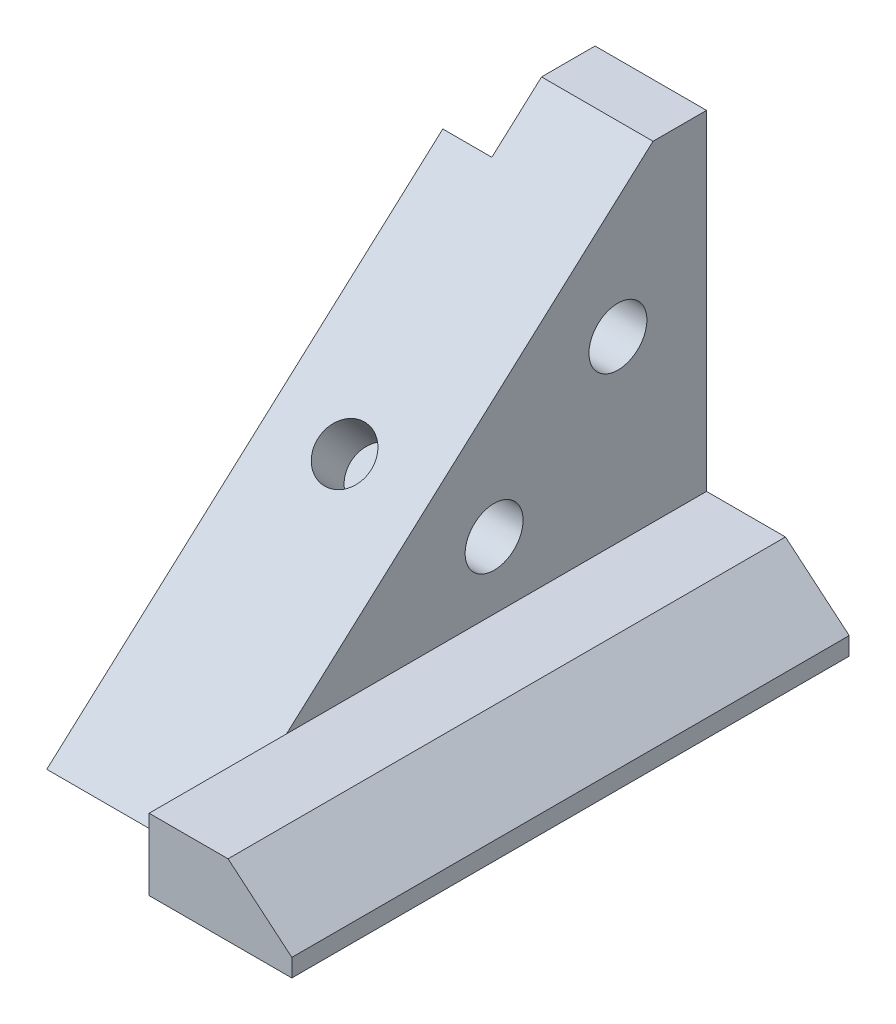
ISO-10303-21;
HEADER;
FILE_DESCRIPTION(('STEP AP214'),'2;1');
FILE_NAME('part.step','',(''),(''),'','','');
FILE_SCHEMA(('AUTOMOTIVE_DESIGN { 1 0 10303 214 1 1 1 1 }'));
ENDSEC;
DATA;
#1=APPLICATION_CONTEXT('core data for automotive mechanical design processes');
#2=APPLICATION_PROTOCOL_DEFINITION('international standard','automotive_design',2000,#1);
#3=PRODUCT_CONTEXT('',#1,'mechanical');
#4=PRODUCT('Part','Part','',(#3));
#5=PRODUCT_RELATED_PRODUCT_CATEGORY('part','',(#4));
#6=PRODUCT_DEFINITION_FORMATION('','',#4);
#7=PRODUCT_DEFINITION_CONTEXT('part definition',#1,'design');
#8=PRODUCT_DEFINITION('design','',#6,#7);
#9=PRODUCT_DEFINITION_SHAPE('','',#8);
#10=(LENGTH_UNIT() NAMED_UNIT(*) SI_UNIT(.MILLI.,.METRE.));
#11=(NAMED_UNIT(*) PLANE_ANGLE_UNIT() SI_UNIT($,.RADIAN.));
#12=(NAMED_UNIT(*) SI_UNIT($,.STERADIAN.) SOLID_ANGLE_UNIT());
#13=UNCERTAINTY_MEASURE_WITH_UNIT(LENGTH_MEASURE(1.E-05),#10,'distance_accuracy_value','');
#14=(GEOMETRIC_REPRESENTATION_CONTEXT(3) GLOBAL_UNCERTAINTY_ASSIGNED_CONTEXT((#13)) GLOBAL_UNIT_ASSIGNED_CONTEXT((#10,
#11,#12)) REPRESENTATION_CONTEXT('',''));
#15=CARTESIAN_POINT('',(0.,0.,0.));
#16=DIRECTION('',(0.,0.,1.));
#17=DIRECTION('',(1.,0.,0.));
#18=AXIS2_PLACEMENT_3D('',#15,#16,#17);
#19=CARTESIAN_POINT('',(36.,0.,0.));
#20=DIRECTION('',(0.,0.,1.));
#21=DIRECTION('',(1.,0.,0.));
#22=AXIS2_PLACEMENT_3D('',#19,#20,#21);
#23=PLANE('',#22);
#24=DIRECTION('',(-0.766044443118975,0.642787609686543,0.));
#25=VECTOR('',#24,1.);
#26=CARTESIAN_POINT('',(30.0655774653491,35.830759957749,0.));
#27=LINE('',#26,#25);
#28=CARTESIAN_POINT('',(68.,4.,0.));
#29=VERTEX_POINT('',#28);
#30=CARTESIAN_POINT('',(53.6989568888697,16.,0.));
#31=VERTEX_POINT('',#30);
#32=EDGE_CURVE('E168',#29,#31,#27,.T.);
#33=ORIENTED_EDGE('',*,*,#32,.F.);
#34=DIRECTION('',(0.,1.,0.));
#35=VECTOR('',#34,1.);
#36=CARTESIAN_POINT('',(68.,0.,0.));
#37=LINE('',#36,#35);
#38=CARTESIAN_POINT('',(68.,0.,0.));
#39=VERTEX_POINT('',#38);
#40=EDGE_CURVE('E167',#39,#29,#37,.T.);
#41=ORIENTED_EDGE('',*,*,#40,.F.);
#42=DIRECTION('',(-1.,0.,0.));
#43=VECTOR('',#42,1.);
#44=CARTESIAN_POINT('',(36.,0.,0.));
#45=LINE('',#44,#43);
#46=CARTESIAN_POINT('',(0.,0.,0.));
#47=VERTEX_POINT('',#46);
#48=EDGE_CURVE('E90',#39,#47,#45,.T.);
#49=ORIENTED_EDGE('',*,*,#48,.T.);
#50=DIRECTION('',(0.,1.,0.));
#51=VECTOR('',#50,1.);
#52=CARTESIAN_POINT('',(0.,0.,0.));
#53=LINE('',#52,#51);
#54=CARTESIAN_POINT('',(0.,54.2555015740803,0.));
#55=VERTEX_POINT('',#54);
#56=EDGE_CURVE('E156',#47,#55,#53,.T.);
#57=ORIENTED_EDGE('',*,*,#56,.T.);
#58=DIRECTION('',(1.,0.,0.));
#59=VECTOR('',#58,1.);
#60=CARTESIAN_POINT('',(0.,54.2555015740803,0.));
#61=LINE('',#60,#59);
#62=CARTESIAN_POINT('',(11.,54.2555015740803,0.));
#63=VERTEX_POINT('',#62);
#64=EDGE_CURVE('E230',#55,#63,#61,.T.);
#65=ORIENTED_EDGE('',*,*,#64,.T.);
#66=DIRECTION('',(0.,1.,0.));
#67=VECTOR('',#66,1.);
#68=CARTESIAN_POINT('',(11.,-0.00104952517931967,0.));
#69=LINE('',#68,#67);
#70=CARTESIAN_POINT('',(11.,90.,0.));
#71=VERTEX_POINT('',#70);
#72=EDGE_CURVE('E177',#63,#71,#69,.T.);
#73=ORIENTED_EDGE('',*,*,#72,.T.);
#74=DIRECTION('',(-1.,0.,0.));
#75=VECTOR('',#74,1.);
#76=CARTESIAN_POINT('',(36.,90.,0.));
#77=LINE('',#76,#75);
#78=CARTESIAN_POINT('',(36.,90.,0.));
#79=VERTEX_POINT('',#78);
#80=EDGE_CURVE('E137',#79,#71,#77,.T.);
#81=ORIENTED_EDGE('',*,*,#80,.F.);
#82=DIRECTION('',(0.,1.,0.));
#83=VECTOR('',#82,1.);
#84=CARTESIAN_POINT('',(36.,0.,0.));
#85=LINE('',#84,#83);
#86=CARTESIAN_POINT('',(36.,16.,0.));
#87=VERTEX_POINT('',#86);
#88=EDGE_CURVE('E129',#87,#79,#85,.T.);
#89=ORIENTED_EDGE('',*,*,#88,.F.);
#90=DIRECTION('',(-1.,0.,0.));
#91=VECTOR('',#90,1.);
#92=CARTESIAN_POINT('',(68.,16.,0.));
#93=LINE('',#92,#91);
#94=EDGE_CURVE('E115',#31,#87,#93,.T.);
#95=ORIENTED_EDGE('',*,*,#94,.F.);
#96=EDGE_LOOP('',(#33,#41,#49,#57,#65,#73,#81,#89,#95));
#97=FACE_BOUND('',#96,.T.);
#98=ADVANCED_FACE('F41',(#97),#23,.F.);
#99=CARTESIAN_POINT('',(68.,16.,0.));
#100=DIRECTION('',(0.,-1.,0.));
#101=DIRECTION('',(0.,0.,-1.));
#102=AXIS2_PLACEMENT_3D('',#99,#100,#101);
#103=PLANE('',#102);
#104=DIRECTION('',(0.,0.,1.));
#105=VECTOR('',#104,1.);
#106=CARTESIAN_POINT('',(53.6989568888697,16.,0.));
#107=LINE('',#106,#105);
#108=CARTESIAN_POINT('',(53.6989568888697,16.,125.));
#109=VERTEX_POINT('',#108);
#110=EDGE_CURVE('E58',#31,#109,#107,.T.);
#111=ORIENTED_EDGE('',*,*,#110,.F.);
#112=ORIENTED_EDGE('',*,*,#94,.T.);
#113=DIRECTION('',(0.,0.,1.));
#114=VECTOR('',#113,1.);
#115=CARTESIAN_POINT('',(36.,16.,0.));
#116=LINE('',#115,#114);
#117=CARTESIAN_POINT('',(36.,16.,94.1853260973612));
#118=VERTEX_POINT('',#117);
#119=EDGE_CURVE('E116',#87,#118,#116,.T.);
#120=ORIENTED_EDGE('',*,*,#119,.T.);
#121=CARTESIAN_POINT('',(36.,16.,125.));
#122=VERTEX_POINT('',#121);
#123=EDGE_CURVE('E133',#118,#122,#116,.T.);
#124=ORIENTED_EDGE('',*,*,#123,.T.);
#125=DIRECTION('',(1.,0.,0.));
#126=VECTOR('',#125,1.);
#127=CARTESIAN_POINT('',(68.,16.,125.));
#128=LINE('',#127,#126);
#129=EDGE_CURVE('E122',#109,#122,#128,.F.);
#130=ORIENTED_EDGE('',*,*,#129,.F.);
#131=EDGE_LOOP('',(#111,#112,#120,#124,#130));
#132=FACE_BOUND('',#131,.T.);
#133=ADVANCED_FACE('F111',(#132),#103,.F.);
#134=CARTESIAN_POINT('',(68.,0.,125.));
#135=DIRECTION('',(0.,0.,1.));
#136=DIRECTION('',(1.,0.,0.));
#137=AXIS2_PLACEMENT_3D('',#134,#135,#136);
#138=PLANE('',#137);
#139=DIRECTION('',(0.,1.,0.));
#140=VECTOR('',#139,1.);
#141=CARTESIAN_POINT('',(68.,0.,125.));
#142=LINE('',#141,#140);
#143=CARTESIAN_POINT('',(68.,0.,125.));
#144=VERTEX_POINT('',#143);
#145=CARTESIAN_POINT('',(68.,4.,125.));
#146=VERTEX_POINT('',#145);
#147=EDGE_CURVE('E44',#144,#146,#142,.T.);
#148=ORIENTED_EDGE('',*,*,#147,.T.);
#149=DIRECTION('',(-0.766044443118975,0.642787609686543,0.));
#150=VECTOR('',#149,1.);
#151=CARTESIAN_POINT('',(68.,4.,125.));
#152=LINE('',#151,#150);
#153=EDGE_CURVE('E166',#146,#109,#152,.T.);
#154=ORIENTED_EDGE('',*,*,#153,.T.);
#155=ORIENTED_EDGE('',*,*,#129,.T.);
#156=DIRECTION('',(0.,1.,0.));
#157=VECTOR('',#156,1.);
#158=CARTESIAN_POINT('',(36.,0.,125.));
#159=LINE('',#158,#157);
#160=CARTESIAN_POINT('',(36.,0.,125.));
#161=VERTEX_POINT('',#160);
#162=EDGE_CURVE('E134',#161,#122,#159,.T.);
#163=ORIENTED_EDGE('',*,*,#162,.F.);
#164=DIRECTION('',(-1.,0.,0.));
#165=VECTOR('',#164,1.);
#166=CARTESIAN_POINT('',(68.,0.,125.));
#167=LINE('',#166,#165);
#168=EDGE_CURVE('E78',#144,#161,#167,.T.);
#169=ORIENTED_EDGE('',*,*,#168,.F.);
#170=EDGE_LOOP('',(#148,#154,#155,#163,#169));
#171=FACE_BOUND('',#170,.T.);
#172=ADVANCED_FACE('F171',(#171),#138,.T.);
#173=CARTESIAN_POINT('',(68.,0.,0.));
#174=DIRECTION('',(1.,0.,0.));
#175=DIRECTION('',(0.,0.,-1.));
#176=AXIS2_PLACEMENT_3D('',#173,#174,#175);
#177=PLANE('',#176);
#178=ORIENTED_EDGE('',*,*,#40,.T.);
#179=DIRECTION('',(0.,0.,1.));
#180=VECTOR('',#179,1.);
#181=CARTESIAN_POINT('',(68.,4.,0.));
#182=LINE('',#181,#180);
#183=EDGE_CURVE('E189',#29,#146,#182,.T.);
#184=ORIENTED_EDGE('',*,*,#183,.T.);
#185=ORIENTED_EDGE('',*,*,#147,.F.);
#186=DIRECTION('',(0.,0.,1.));
#187=VECTOR('',#186,1.);
#188=CARTESIAN_POINT('',(68.,0.,0.));
#189=LINE('',#188,#187);
#190=EDGE_CURVE('E163',#39,#144,#189,.T.);
#191=ORIENTED_EDGE('',*,*,#190,.F.);
#192=EDGE_LOOP('',(#178,#184,#185,#191));
#193=FACE_BOUND('',#192,.T.);
#194=ADVANCED_FACE('F186',(#193),#177,.T.);
#195=CARTESIAN_POINT('',(0.,0.,0.));
#196=DIRECTION('',(1.,0.,0.));
#197=DIRECTION('',(0.,0.,-1.));
#198=AXIS2_PLACEMENT_3D('',#195,#196,#197);
#199=PLANE('',#198);
#200=CARTESIAN_POINT('',(0.,31.,47.6366073776308));
#201=DIRECTION('',(1.,0.,0.));
#202=DIRECTION('',(0.,0.,-1.));
#203=AXIS2_PLACEMENT_3D('',#200,#201,#202);
#204=CIRCLE('',#203,6.50000000000001);
#205=CARTESIAN_POINT('',(0.,31.,41.1366073776308));
#206=VERTEX_POINT('',#205);
#207=EDGE_CURVE('E146',#206,#206,#204,.T.);
#208=ORIENTED_EDGE('',*,*,#207,.T.);
#209=EDGE_LOOP('',(#208));
#210=FACE_BOUND('',#209,.T.);
#211=CARTESIAN_POINT('',(0.,56.,19.8712945069006));
#212=DIRECTION('',(1.,0.,0.));
#213=DIRECTION('',(0.,0.,-1.));
#214=AXIS2_PLACEMENT_3D('',#211,#212,#213);
#215=CIRCLE('',#214,6.5);
#216=CARTESIAN_POINT('',(0.,56.,13.3712945069006));
#217=VERTEX_POINT('',#216);
#218=EDGE_CURVE('E125',#217,#217,#215,.T.);
#219=ORIENTED_EDGE('',*,*,#218,.T.);
#220=EDGE_LOOP('',(#219));
#221=FACE_BOUND('',#220,.T.);
#222=DIRECTION('',(0.,0.743144825477398,0.669130606358854));
#223=VECTOR('',#222,1.);
#224=CARTESIAN_POINT('',(0.,24.2910791601833,-26.9800871265214));
#225=LINE('',#224,#223);
#226=CARTESIAN_POINT('',(0.,79.9630409046172,23.147172382161));
#227=VERTEX_POINT('',#226);
#228=EDGE_CURVE('E232',#55,#227,#225,.T.);
#229=ORIENTED_EDGE('',*,*,#228,.F.);
#230=ORIENTED_EDGE('',*,*,#56,.F.);
#231=DIRECTION('',(0.,0.,1.));
#232=VECTOR('',#231,1.);
#233=CARTESIAN_POINT('',(0.,0.,0.));
#234=LINE('',#233,#232);
#235=CARTESIAN_POINT('',(0.,0.,111.955126334628));
#236=VERTEX_POINT('',#235);
#237=EDGE_CURVE('E153',#47,#236,#234,.T.);
#238=ORIENTED_EDGE('',*,*,#237,.T.);
#239=DIRECTION('',(0.,-0.669130606358854,0.743144825477398));
#240=VECTOR('',#239,1.);
#241=CARTESIAN_POINT('',(0.,55.6709122192545,50.1263145119663));
#242=LINE('',#241,#240);
#243=EDGE_CURVE('E151',#227,#236,#242,.T.);
#244=ORIENTED_EDGE('',*,*,#243,.F.);
#245=EDGE_LOOP('',(#229,#230,#238,#244));
#246=FACE_BOUND('',#245,.T.);
#247=ADVANCED_FACE('F253',(#210,#221,#246),#199,.F.);
#248=CARTESIAN_POINT('',(36.,90.,0.));
#249=DIRECTION('',(0.,-1.,0.));
#250=DIRECTION('',(0.,0.,-1.));
#251=AXIS2_PLACEMENT_3D('',#248,#249,#250);
#252=PLANE('',#251);
#253=ORIENTED_EDGE('',*,*,#80,.T.);
#254=DIRECTION('',(0.,0.,1.));
#255=VECTOR('',#254,1.);
#256=CARTESIAN_POINT('',(11.,90.,-0.000944996716059632));
#257=LINE('',#256,#255);
#258=CARTESIAN_POINT('',(11.,90.,12.));
#259=VERTEX_POINT('',#258);
#260=EDGE_CURVE('E202',#71,#259,#257,.T.);
#261=ORIENTED_EDGE('',*,*,#260,.T.);
#262=DIRECTION('',(-1.,0.,0.));
#263=VECTOR('',#262,1.);
#264=CARTESIAN_POINT('',(36.,90.,12.));
#265=LINE('',#264,#263);
#266=CARTESIAN_POINT('',(36.,90.,12.));
#267=VERTEX_POINT('',#266);
#268=EDGE_CURVE('E11',#267,#259,#265,.T.);
#269=ORIENTED_EDGE('',*,*,#268,.F.);
#270=DIRECTION('',(0.,0.,1.));
#271=VECTOR('',#270,1.);
#272=CARTESIAN_POINT('',(36.,90.,0.));
#273=LINE('',#272,#271);
#274=EDGE_CURVE('E196',#79,#267,#273,.T.);
#275=ORIENTED_EDGE('',*,*,#274,.F.);
#276=EDGE_LOOP('',(#253,#261,#269,#275));
#277=FACE_BOUND('',#276,.T.);
#278=ADVANCED_FACE('F205',(#277),#252,.F.);
#279=CARTESIAN_POINT('',(36.,55.6709122192545,50.1263145119663));
#280=DIRECTION('',(0.,-0.743144825477398,-0.669130606358854));
#281=DIRECTION('',(0.,0.669130606358854,-0.743144825477398));
#282=AXIS2_PLACEMENT_3D('',#279,#280,#281);
#283=PLANE('',#282);
#284=CARTESIAN_POINT('',(17.,44.8317506260432,62.1644230276428));
#285=DIRECTION('',(0.,0.743144825477398,0.669130606358854));
#286=DIRECTION('',(0.,-0.669130606358854,0.743144825477398));
#287=AXIS2_PLACEMENT_3D('',#284,#285,#286);
#288=CIRCLE('',#287,5.99999999999999);
#289=CARTESIAN_POINT('',(17.,40.8169669878901,66.6232919805072));
#290=VERTEX_POINT('',#289);
#291=EDGE_CURVE('E241',#290,#290,#288,.T.);
#292=ORIENTED_EDGE('',*,*,#291,.F.);
#293=EDGE_LOOP('',(#292));
#294=FACE_BOUND('',#293,.T.);
#295=DIRECTION('',(0.,-0.669130606358854,0.743144825477398));
#296=VECTOR('',#295,1.);
#297=CARTESIAN_POINT('',(11.,55.6709122192545,50.1263145119663));
#298=LINE('',#297,#296);
#299=CARTESIAN_POINT('',(11.,79.9630409046172,23.147172382161));
#300=VERTEX_POINT('',#299);
#301=EDGE_CURVE('E215',#259,#300,#298,.T.);
#302=ORIENTED_EDGE('',*,*,#301,.T.);
#303=DIRECTION('',(-1.,0.,0.));
#304=VECTOR('',#303,1.);
#305=CARTESIAN_POINT('',(0.,79.9630409046172,23.147172382161));
#306=LINE('',#305,#304);
#307=EDGE_CURVE('E236',#300,#227,#306,.T.);
#308=ORIENTED_EDGE('',*,*,#307,.T.);
#309=ORIENTED_EDGE('',*,*,#243,.T.);
#310=DIRECTION('',(-1.,0.,0.));
#311=VECTOR('',#310,1.);
#312=CARTESIAN_POINT('',(36.,0.,111.955126334628));
#313=LINE('',#312,#311);
#314=CARTESIAN_POINT('',(36.,0.,111.955126334628));
#315=VERTEX_POINT('',#314);
#316=EDGE_CURVE('E51',#315,#236,#313,.T.);
#317=ORIENTED_EDGE('',*,*,#316,.F.);
#318=DIRECTION('',(0.,-0.669130606358854,0.743144825477398));
#319=VECTOR('',#318,1.);
#320=CARTESIAN_POINT('',(36.,55.6709122192545,50.1263145119663));
#321=LINE('',#320,#319);
#322=EDGE_CURVE('E142',#118,#315,#321,.T.);
#323=ORIENTED_EDGE('',*,*,#322,.F.);
#324=EDGE_CURVE('E131',#267,#118,#321,.T.);
#325=ORIENTED_EDGE('',*,*,#324,.F.);
#326=ORIENTED_EDGE('',*,*,#268,.T.);
#327=EDGE_LOOP('',(#302,#308,#309,#317,#323,#325,#326));
#328=FACE_BOUND('',#327,.T.);
#329=ADVANCED_FACE('F208',(#294,#328),#283,.F.);
#330=CARTESIAN_POINT('',(36.,0.,0.));
#331=DIRECTION('',(0.,-1.,0.));
#332=DIRECTION('',(0.,0.,-1.));
#333=AXIS2_PLACEMENT_3D('',#330,#331,#332);
#334=PLANE('',#333);
#335=ORIENTED_EDGE('',*,*,#237,.F.);
#336=ORIENTED_EDGE('',*,*,#48,.F.);
#337=ORIENTED_EDGE('',*,*,#190,.T.);
#338=ORIENTED_EDGE('',*,*,#168,.T.);
#339=DIRECTION('',(0.,0.,1.));
#340=VECTOR('',#339,1.);
#341=CARTESIAN_POINT('',(36.,0.,0.));
#342=LINE('',#341,#340);
#343=EDGE_CURVE('E175',#315,#161,#342,.T.);
#344=ORIENTED_EDGE('',*,*,#343,.F.);
#345=ORIENTED_EDGE('',*,*,#316,.T.);
#346=EDGE_LOOP('',(#335,#336,#337,#338,#344,#345));
#347=FACE_BOUND('',#346,.T.);
#348=ADVANCED_FACE('F179',(#347),#334,.T.);
#349=CARTESIAN_POINT('',(36.,31.,47.6366073776308));
#350=DIRECTION('',(-1.,0.,0.));
#351=DIRECTION('',(0.,0.,1.));
#352=AXIS2_PLACEMENT_3D('',#349,#350,#351);
#353=CYLINDRICAL_SURFACE('',#352,6.50000000000001);
#354=CARTESIAN_POINT('',(36.,31.,47.6366073776308));
#355=DIRECTION('',(1.,0.,0.));
#356=DIRECTION('',(0.,0.,-1.));
#357=AXIS2_PLACEMENT_3D('',#354,#355,#356);
#358=CIRCLE('',#357,6.50000000000001);
#359=CARTESIAN_POINT('',(36.,31.,41.1366073776308));
#360=VERTEX_POINT('',#359);
#361=EDGE_CURVE('E198',#360,#360,#358,.T.);
#362=ORIENTED_EDGE('',*,*,#361,.T.);
#363=EDGE_LOOP('',(#362));
#364=FACE_BOUND('',#363,.T.);
#365=ORIENTED_EDGE('',*,*,#207,.F.);
#366=EDGE_LOOP('',(#365));
#367=FACE_BOUND('',#366,.T.);
#368=ADVANCED_FACE('F280',(#364,#367),#353,.F.);
#369=CARTESIAN_POINT('',(36.,56.,19.8712945069006));
#370=DIRECTION('',(-1.,0.,0.));
#371=DIRECTION('',(0.,0.,1.));
#372=AXIS2_PLACEMENT_3D('',#369,#370,#371);
#373=CYLINDRICAL_SURFACE('',#372,6.5);
#374=CARTESIAN_POINT('',(36.,56.,19.8712945069006));
#375=DIRECTION('',(1.,0.,0.));
#376=DIRECTION('',(0.,0.,-1.));
#377=AXIS2_PLACEMENT_3D('',#374,#375,#376);
#378=CIRCLE('',#377,6.5);
#379=CARTESIAN_POINT('',(36.,56.,13.3712945069006));
#380=VERTEX_POINT('',#379);
#381=EDGE_CURVE('E158',#380,#380,#378,.T.);
#382=ORIENTED_EDGE('',*,*,#381,.T.);
#383=EDGE_LOOP('',(#382));
#384=FACE_BOUND('',#383,.T.);
#385=ORIENTED_EDGE('',*,*,#218,.F.);
#386=EDGE_LOOP('',(#385));
#387=FACE_BOUND('',#386,.T.);
#388=ADVANCED_FACE('F43',(#384,#387),#373,.F.);
#389=CARTESIAN_POINT('',(36.,0.,0.));
#390=DIRECTION('',(1.,0.,0.));
#391=DIRECTION('',(0.,0.,-1.));
#392=AXIS2_PLACEMENT_3D('',#389,#390,#391);
#393=PLANE('',#392);
#394=ORIENTED_EDGE('',*,*,#119,.F.);
#395=ORIENTED_EDGE('',*,*,#88,.T.);
#396=ORIENTED_EDGE('',*,*,#274,.T.);
#397=ORIENTED_EDGE('',*,*,#324,.T.);
#398=EDGE_LOOP('',(#394,#395,#396,#397));
#399=FACE_BOUND('',#398,.T.);
#400=ORIENTED_EDGE('',*,*,#381,.F.);
#401=EDGE_LOOP('',(#400));
#402=FACE_BOUND('',#401,.T.);
#403=ORIENTED_EDGE('',*,*,#361,.F.);
#404=EDGE_LOOP('',(#403));
#405=FACE_BOUND('',#404,.T.);
#406=ADVANCED_FACE('F127',(#399,#402,#405),#393,.T.);
#407=CARTESIAN_POINT('',(36.,0.,0.));
#408=DIRECTION('',(1.,0.,0.));
#409=DIRECTION('',(0.,0.,-1.));
#410=AXIS2_PLACEMENT_3D('',#407,#408,#409);
#411=PLANE('',#410);
#412=ORIENTED_EDGE('',*,*,#123,.F.);
#413=ORIENTED_EDGE('',*,*,#322,.T.);
#414=ORIENTED_EDGE('',*,*,#343,.T.);
#415=ORIENTED_EDGE('',*,*,#162,.T.);
#416=EDGE_LOOP('',(#412,#413,#414,#415));
#417=FACE_BOUND('',#416,.T.);
#418=ADVANCED_FACE('F176',(#417),#411,.F.);
#419=CARTESIAN_POINT('',(0.,24.2910791601833,-26.9800871265214));
#420=DIRECTION('',(0.,0.669130606358854,-0.743144825477398));
#421=DIRECTION('',(0.,0.743144825477398,0.669130606358854));
#422=AXIS2_PLACEMENT_3D('',#419,#420,#421);
#423=PLANE('',#422);
#424=ORIENTED_EDGE('',*,*,#228,.T.);
#425=ORIENTED_EDGE('',*,*,#307,.F.);
#426=DIRECTION('',(0.,0.743144825477398,0.669130606358854));
#427=VECTOR('',#426,1.);
#428=CARTESIAN_POINT('',(11.,24.2910791601833,-26.9800871265214));
#429=LINE('',#428,#427);
#430=EDGE_CURVE('E226',#63,#300,#429,.T.);
#431=ORIENTED_EDGE('',*,*,#430,.F.);
#432=ORIENTED_EDGE('',*,*,#64,.F.);
#433=EDGE_LOOP('',(#424,#425,#431,#432));
#434=FACE_BOUND('',#433,.T.);
#435=ADVANCED_FACE('F251',(#434),#423,.T.);
#436=CARTESIAN_POINT('',(11.,-0.00104952517931967,-0.000944996716059632));
#437=DIRECTION('',(-1.,0.,0.));
#438=DIRECTION('',(0.,0.,1.));
#439=AXIS2_PLACEMENT_3D('',#436,#437,#438);
#440=PLANE('',#439);
#441=ORIENTED_EDGE('',*,*,#72,.F.);
#442=ORIENTED_EDGE('',*,*,#430,.T.);
#443=ORIENTED_EDGE('',*,*,#301,.F.);
#444=ORIENTED_EDGE('',*,*,#260,.F.);
#445=EDGE_LOOP('',(#441,#442,#443,#444));
#446=FACE_BOUND('',#445,.T.);
#447=ADVANCED_FACE('F229',(#446),#440,.T.);
#448=CARTESIAN_POINT('',(17.,36.6571575457918,54.8039863576954));
#449=DIRECTION('',(0.,0.743144825477398,0.669130606358854));
#450=DIRECTION('',(0.,-0.669130606358854,0.743144825477398));
#451=AXIS2_PLACEMENT_3D('',#448,#449,#450);
#452=CYLINDRICAL_SURFACE('',#451,5.99999999999999);
#453=CARTESIAN_POINT('',(17.,36.6571575457918,54.8039863576954));
#454=DIRECTION('',(0.,0.743144825477398,0.669130606358854));
#455=DIRECTION('',(0.,-0.669130606358854,0.743144825477398));
#456=AXIS2_PLACEMENT_3D('',#453,#454,#455);
#457=CIRCLE('',#456,5.99999999999999);
#458=CARTESIAN_POINT('',(17.,32.6423739076387,59.2628553105598));
#459=VERTEX_POINT('',#458);
#460=EDGE_CURVE('E231',#459,#459,#457,.T.);
#461=ORIENTED_EDGE('',*,*,#460,.F.);
#462=EDGE_LOOP('',(#461));
#463=FACE_BOUND('',#462,.T.);
#464=ORIENTED_EDGE('',*,*,#291,.T.);
#465=EDGE_LOOP('',(#464));
#466=FACE_BOUND('',#465,.T.);
#467=ADVANCED_FACE('F257',(#463,#466),#452,.F.);
#468=CARTESIAN_POINT('',(0.,47.4963191390032,42.7658778420189));
#469=DIRECTION('',(0.,0.743144825477398,0.669130606358854));
#470=DIRECTION('',(0.,-0.669130606358854,0.743144825477398));
#471=AXIS2_PLACEMENT_3D('',#468,#469,#470);
#472=PLANE('',#471);
#473=ORIENTED_EDGE('',*,*,#460,.T.);
#474=EDGE_LOOP('',(#473));
#475=FACE_BOUND('',#474,.T.);
#476=ADVANCED_FACE('F346',(#475),#472,.T.);
#477=CARTESIAN_POINT('',(30.0655774653491,35.830759957749,0.));
#478=DIRECTION('',(0.642787609686543,0.766044443118975,0.));
#479=DIRECTION('',(-0.766044443118975,0.642787609686543,0.));
#480=AXIS2_PLACEMENT_3D('',#477,#478,#479);
#481=PLANE('',#480);
#482=ORIENTED_EDGE('',*,*,#183,.F.);
#483=ORIENTED_EDGE('',*,*,#32,.T.);
#484=ORIENTED_EDGE('',*,*,#110,.T.);
#485=ORIENTED_EDGE('',*,*,#153,.F.);
#486=EDGE_LOOP('',(#482,#483,#484,#485));
#487=FACE_BOUND('',#486,.T.);
#488=ADVANCED_FACE('F247',(#487),#481,.T.);
#489=CLOSED_SHELL('',(#98,#133,#172,#194,#247,#278,#329,#348,#368,#388,#406,#418,#435,#447,#467,
#476,#488));
#490=MANIFOLD_SOLID_BREP('B2',#489);
#491=ADVANCED_BREP_SHAPE_REPRESENTATION('',(#18,#490),#14);
#492=SHAPE_DEFINITION_REPRESENTATION(#9,#491);
ENDSEC;
END-ISO-10303-21;
